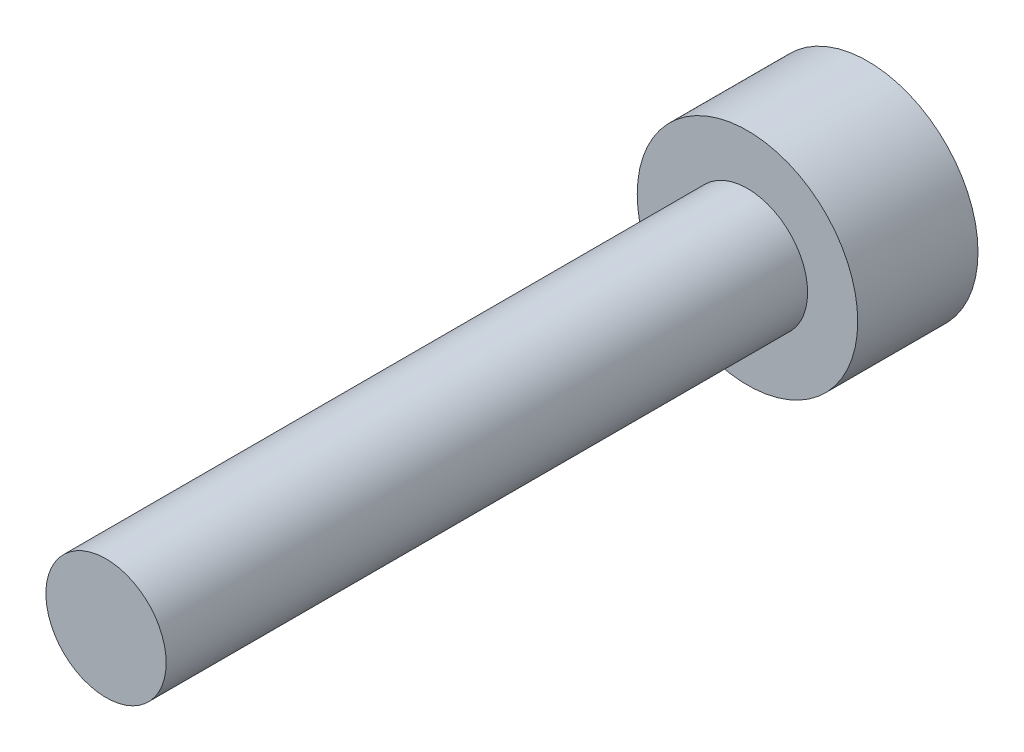
ISO-10303-21;
HEADER;
FILE_DESCRIPTION(('STEP AP214'),'2;1');
FILE_NAME('part.step','',(''),(''),'','','');
FILE_SCHEMA(('AUTOMOTIVE_DESIGN { 1 0 10303 214 1 1 1 1 }'));
ENDSEC;
DATA;
#1=APPLICATION_CONTEXT('core data for automotive mechanical design processes');
#2=APPLICATION_PROTOCOL_DEFINITION('international standard','automotive_design',2000,#1);
#3=PRODUCT_CONTEXT('',#1,'mechanical');
#4=PRODUCT('Part','Part','',(#3));
#5=PRODUCT_RELATED_PRODUCT_CATEGORY('part','',(#4));
#6=PRODUCT_DEFINITION_FORMATION('','',#4);
#7=PRODUCT_DEFINITION_CONTEXT('part definition',#1,'design');
#8=PRODUCT_DEFINITION('design','',#6,#7);
#9=PRODUCT_DEFINITION_SHAPE('','',#8);
#10=(LENGTH_UNIT() NAMED_UNIT(*) SI_UNIT(.MILLI.,.METRE.));
#11=(NAMED_UNIT(*) PLANE_ANGLE_UNIT() SI_UNIT($,.RADIAN.));
#12=(NAMED_UNIT(*) SI_UNIT($,.STERADIAN.) SOLID_ANGLE_UNIT());
#13=UNCERTAINTY_MEASURE_WITH_UNIT(LENGTH_MEASURE(1.E-05),#10,'distance_accuracy_value','');
#14=(GEOMETRIC_REPRESENTATION_CONTEXT(3) GLOBAL_UNCERTAINTY_ASSIGNED_CONTEXT((#13)) GLOBAL_UNIT_ASSIGNED_CONTEXT((#10,
#11,#12)) REPRESENTATION_CONTEXT('',''));
#15=CARTESIAN_POINT('',(0.,0.,0.));
#16=DIRECTION('',(0.,0.,1.));
#17=DIRECTION('',(1.,0.,0.));
#18=AXIS2_PLACEMENT_3D('',#15,#16,#17);
#19=CARTESIAN_POINT('',(0.,0.,0.));
#20=DIRECTION('',(0.,0.,-1.));
#21=DIRECTION('',(-1.,0.,0.));
#22=AXIS2_PLACEMENT_3D('',#19,#20,#21);
#23=CYLINDRICAL_SURFACE('',#22,2.75);
#24=CARTESIAN_POINT('',(0.,0.,0.));
#25=DIRECTION('',(0.,0.,1.));
#26=DIRECTION('',(1.,0.,0.));
#27=AXIS2_PLACEMENT_3D('',#24,#25,#26);
#28=CIRCLE('',#27,2.75);
#29=CARTESIAN_POINT('',(2.75,0.,0.));
#30=VERTEX_POINT('',#29);
#31=EDGE_CURVE('E42',#30,#30,#28,.T.);
#32=ORIENTED_EDGE('',*,*,#31,.F.);
#33=EDGE_LOOP('',(#32));
#34=FACE_BOUND('',#33,.T.);
#35=CARTESIAN_POINT('',(0.,0.,-3.));
#36=DIRECTION('',(0.,0.,1.));
#37=DIRECTION('',(1.,0.,0.));
#38=AXIS2_PLACEMENT_3D('',#35,#36,#37);
#39=CIRCLE('',#38,2.75);
#40=CARTESIAN_POINT('',(2.75,0.,-3.));
#41=VERTEX_POINT('',#40);
#42=EDGE_CURVE('E37',#41,#41,#39,.T.);
#43=ORIENTED_EDGE('',*,*,#42,.T.);
#44=EDGE_LOOP('',(#43));
#45=FACE_BOUND('',#44,.T.);
#46=ADVANCED_FACE('F40',(#34,#45),#23,.T.);
#47=CARTESIAN_POINT('',(0.,0.,0.));
#48=DIRECTION('',(0.,0.,1.));
#49=DIRECTION('',(1.,0.,0.));
#50=AXIS2_PLACEMENT_3D('',#47,#48,#49);
#51=PLANE('',#50);
#52=CARTESIAN_POINT('',(0.,0.,0.));
#53=DIRECTION('',(0.,0.,1.));
#54=DIRECTION('',(1.,0.,0.));
#55=AXIS2_PLACEMENT_3D('',#52,#53,#54);
#56=CIRCLE('',#55,1.5);
#57=CARTESIAN_POINT('',(1.5,0.,0.));
#58=VERTEX_POINT('',#57);
#59=EDGE_CURVE('E10',#58,#58,#56,.T.);
#60=ORIENTED_EDGE('',*,*,#59,.F.);
#61=EDGE_LOOP('',(#60));
#62=FACE_BOUND('',#61,.T.);
#63=ORIENTED_EDGE('',*,*,#31,.T.);
#64=EDGE_LOOP('',(#63));
#65=FACE_BOUND('',#64,.T.);
#66=ADVANCED_FACE('F62',(#62,#65),#51,.T.);
#67=CARTESIAN_POINT('',(0.,0.,-3.));
#68=DIRECTION('',(0.,0.,1.));
#69=DIRECTION('',(1.,0.,0.));
#70=AXIS2_PLACEMENT_3D('',#67,#68,#69);
#71=PLANE('',#70);
#72=ORIENTED_EDGE('',*,*,#42,.F.);
#73=EDGE_LOOP('',(#72));
#74=FACE_BOUND('',#73,.T.);
#75=ADVANCED_FACE('F59',(#74),#71,.F.);
#76=CARTESIAN_POINT('',(0.,0.,16.));
#77=DIRECTION('',(0.,0.,-1.));
#78=DIRECTION('',(-1.,0.,0.));
#79=AXIS2_PLACEMENT_3D('',#76,#77,#78);
#80=CYLINDRICAL_SURFACE('',#79,1.5);
#81=CARTESIAN_POINT('',(0.,0.,16.));
#82=DIRECTION('',(0.,0.,1.));
#83=DIRECTION('',(1.,0.,0.));
#84=AXIS2_PLACEMENT_3D('',#81,#82,#83);
#85=CIRCLE('',#84,1.5);
#86=CARTESIAN_POINT('',(1.5,0.,16.));
#87=VERTEX_POINT('',#86);
#88=EDGE_CURVE('E49',#87,#87,#85,.T.);
#89=ORIENTED_EDGE('',*,*,#88,.F.);
#90=EDGE_LOOP('',(#89));
#91=FACE_BOUND('',#90,.T.);
#92=ORIENTED_EDGE('',*,*,#59,.T.);
#93=EDGE_LOOP('',(#92));
#94=FACE_BOUND('',#93,.T.);
#95=ADVANCED_FACE('F58',(#91,#94),#80,.T.);
#96=CARTESIAN_POINT('',(0.,0.,16.));
#97=DIRECTION('',(0.,0.,1.));
#98=DIRECTION('',(1.,0.,0.));
#99=AXIS2_PLACEMENT_3D('',#96,#97,#98);
#100=PLANE('',#99);
#101=ORIENTED_EDGE('',*,*,#88,.T.);
#102=EDGE_LOOP('',(#101));
#103=FACE_BOUND('',#102,.T.);
#104=ADVANCED_FACE('F70',(#103),#100,.T.);
#105=CLOSED_SHELL('',(#46,#66,#75,#95,#104));
#106=MANIFOLD_SOLID_BREP('B2',#105);
#107=ADVANCED_BREP_SHAPE_REPRESENTATION('',(#18,#106),#14);
#108=SHAPE_DEFINITION_REPRESENTATION(#9,#107);
ENDSEC;
END-ISO-10303-21;
